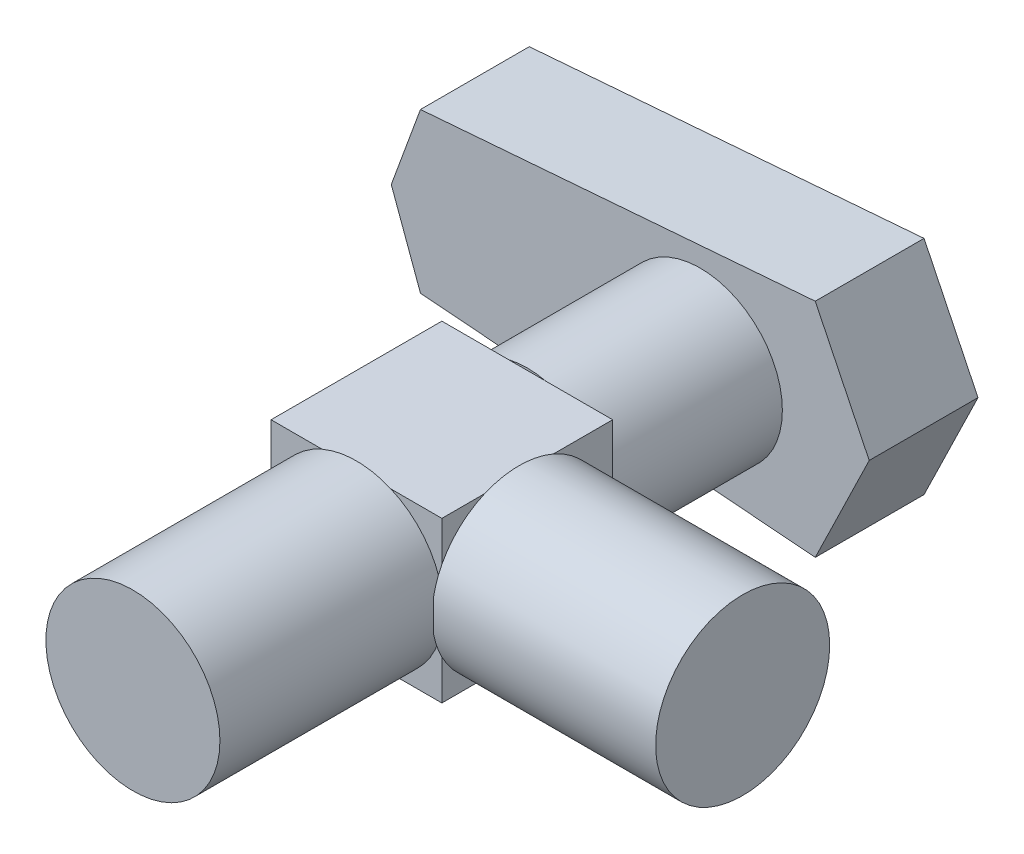
ISO-10303-21;
HEADER;
FILE_DESCRIPTION(('STEP AP214'),'2;1');
FILE_NAME('part.step','',(''),(''),'','','');
FILE_SCHEMA(('AUTOMOTIVE_DESIGN { 1 0 10303 214 1 1 1 1 }'));
ENDSEC;
DATA;
#1=APPLICATION_CONTEXT('core data for automotive mechanical design processes');
#2=APPLICATION_PROTOCOL_DEFINITION('international standard','automotive_design',2000,#1);
#3=PRODUCT_CONTEXT('',#1,'mechanical');
#4=PRODUCT('Part','Part','',(#3));
#5=PRODUCT_RELATED_PRODUCT_CATEGORY('part','',(#4));
#6=PRODUCT_DEFINITION_FORMATION('','',#4);
#7=PRODUCT_DEFINITION_CONTEXT('part definition',#1,'design');
#8=PRODUCT_DEFINITION('design','',#6,#7);
#9=PRODUCT_DEFINITION_SHAPE('','',#8);
#10=(LENGTH_UNIT() NAMED_UNIT(*) SI_UNIT(.MILLI.,.METRE.));
#11=(NAMED_UNIT(*) PLANE_ANGLE_UNIT() SI_UNIT($,.RADIAN.));
#12=(NAMED_UNIT(*) SI_UNIT($,.STERADIAN.) SOLID_ANGLE_UNIT());
#13=UNCERTAINTY_MEASURE_WITH_UNIT(LENGTH_MEASURE(1.E-05),#10,'distance_accuracy_value','');
#14=(GEOMETRIC_REPRESENTATION_CONTEXT(3) GLOBAL_UNCERTAINTY_ASSIGNED_CONTEXT((#13)) GLOBAL_UNIT_ASSIGNED_CONTEXT((#10,
#11,#12)) REPRESENTATION_CONTEXT('',''));
#15=CARTESIAN_POINT('',(0.,0.,0.));
#16=DIRECTION('',(0.,0.,1.));
#17=DIRECTION('',(1.,0.,0.));
#18=AXIS2_PLACEMENT_3D('',#15,#16,#17);
#19=CARTESIAN_POINT('',(-7.85,-7.35,7.85));
#20=DIRECTION('',(0.,0.,1.));
#21=DIRECTION('',(1.,0.,0.));
#22=AXIS2_PLACEMENT_3D('',#19,#20,#21);
#23=PLANE('',#22);
#24=DIRECTION('',(0.,1.,0.));
#25=VECTOR('',#24,1.);
#26=CARTESIAN_POINT('',(7.85,-7.35,7.85));
#27=LINE('',#26,#25);
#28=CARTESIAN_POINT('',(7.85,-3.68646171823335,7.85));
#29=VERTEX_POINT('',#28);
#30=CARTESIAN_POINT('',(7.85,-1.54191439451094,7.85));
#31=VERTEX_POINT('',#30);
#32=EDGE_CURVE('E178',#29,#31,#27,.T.);
#33=ORIENTED_EDGE('',*,*,#32,.T.);
#34=CARTESIAN_POINT('',(0.,0.,7.85));
#35=DIRECTION('',(0.,0.,1.));
#36=DIRECTION('',(1.,0.,0.));
#37=AXIS2_PLACEMENT_3D('',#34,#35,#36);
#38=CIRCLE('',#37,8.);
#39=CARTESIAN_POINT('',(3.15871809441742,-7.35,7.85));
#40=VERTEX_POINT('',#39);
#41=EDGE_CURVE('E192',#40,#31,#38,.T.);
#42=ORIENTED_EDGE('',*,*,#41,.F.);
#43=DIRECTION('',(1.,0.,0.));
#44=VECTOR('',#43,1.);
#45=CARTESIAN_POINT('',(-7.85,-7.35,7.85));
#46=LINE('',#45,#44);
#47=CARTESIAN_POINT('',(7.85,-7.35,7.85));
#48=VERTEX_POINT('',#47);
#49=EDGE_CURVE('E229',#40,#48,#46,.T.);
#50=ORIENTED_EDGE('',*,*,#49,.T.);
#51=EDGE_CURVE('E181',#48,#29,#27,.T.);
#52=ORIENTED_EDGE('',*,*,#51,.T.);
#53=EDGE_LOOP('',(#33,#42,#50,#52));
#54=FACE_BOUND('',#53,.T.);
#55=ADVANCED_FACE('F31',(#54),#23,.T.);
#56=CARTESIAN_POINT('',(-7.85,-7.35,7.85));
#57=VERTEX_POINT('',#56);
#58=CARTESIAN_POINT('',(-3.15871809441742,-7.35,7.85));
#59=VERTEX_POINT('',#58);
#60=EDGE_CURVE('E227',#57,#59,#46,.T.);
#61=ORIENTED_EDGE('',*,*,#60,.T.);
#62=CARTESIAN_POINT('',(-7.85,-1.54191439451093,7.85));
#63=VERTEX_POINT('',#62);
#64=EDGE_CURVE('E54',#63,#59,#38,.T.);
#65=ORIENTED_EDGE('',*,*,#64,.F.);
#66=DIRECTION('',(0.,1.,0.));
#67=VECTOR('',#66,1.);
#68=CARTESIAN_POINT('',(-7.85,-7.35,7.85));
#69=LINE('',#68,#67);
#70=EDGE_CURVE('E207',#57,#63,#69,.T.);
#71=ORIENTED_EDGE('',*,*,#70,.F.);
#72=EDGE_LOOP('',(#61,#65,#71));
#73=FACE_BOUND('',#72,.T.);
#74=ADVANCED_FACE('F336',(#73),#23,.T.);
#75=CARTESIAN_POINT('',(-7.85,1.54191439451093,7.85));
#76=VERTEX_POINT('',#75);
#77=CARTESIAN_POINT('',(-7.85,7.35,7.85));
#78=VERTEX_POINT('',#77);
#79=EDGE_CURVE('E46',#76,#78,#69,.T.);
#80=ORIENTED_EDGE('',*,*,#79,.F.);
#81=CARTESIAN_POINT('',(-3.15871809441742,7.35,7.85));
#82=VERTEX_POINT('',#81);
#83=EDGE_CURVE('E574',#82,#76,#38,.T.);
#84=ORIENTED_EDGE('',*,*,#83,.F.);
#85=DIRECTION('',(1.,0.,0.));
#86=VECTOR('',#85,1.);
#87=CARTESIAN_POINT('',(-7.85,7.35,7.85));
#88=LINE('',#87,#86);
#89=EDGE_CURVE('E243',#78,#82,#88,.T.);
#90=ORIENTED_EDGE('',*,*,#89,.F.);
#91=EDGE_LOOP('',(#80,#84,#90));
#92=FACE_BOUND('',#91,.T.);
#93=ADVANCED_FACE('F341',(#92),#23,.T.);
#94=CARTESIAN_POINT('',(3.15871809441742,7.35,7.85));
#95=VERTEX_POINT('',#94);
#96=CARTESIAN_POINT('',(7.85,7.35,7.85));
#97=VERTEX_POINT('',#96);
#98=EDGE_CURVE('E185',#95,#97,#88,.T.);
#99=ORIENTED_EDGE('',*,*,#98,.F.);
#100=CARTESIAN_POINT('',(7.85,1.54191439451094,7.85));
#101=VERTEX_POINT('',#100);
#102=EDGE_CURVE('E183',#101,#95,#38,.T.);
#103=ORIENTED_EDGE('',*,*,#102,.F.);
#104=CARTESIAN_POINT('',(7.85,3.68646171823335,7.85));
#105=VERTEX_POINT('',#104);
#106=EDGE_CURVE('E168',#101,#105,#27,.T.);
#107=ORIENTED_EDGE('',*,*,#106,.T.);
#108=EDGE_CURVE('E179',#105,#97,#27,.T.);
#109=ORIENTED_EDGE('',*,*,#108,.T.);
#110=EDGE_LOOP('',(#99,#103,#107,#109));
#111=FACE_BOUND('',#110,.T.);
#112=ADVANCED_FACE('F184',(#111),#23,.T.);
#113=CARTESIAN_POINT('',(28.4,0.,0.749999999999999));
#114=DIRECTION('',(-1.,0.,0.));
#115=DIRECTION('',(0.,0.,1.));
#116=AXIS2_PLACEMENT_3D('',#113,#114,#115);
#117=CYLINDRICAL_SURFACE('',#116,8.);
#118=CARTESIAN_POINT('',(28.4,0.,0.749999999999999));
#119=DIRECTION('',(1.,0.,0.));
#120=DIRECTION('',(0.,0.,-1.));
#121=AXIS2_PLACEMENT_3D('',#118,#119,#120);
#122=CIRCLE('',#121,8.);
#123=CARTESIAN_POINT('',(28.4,0.,-7.25));
#124=VERTEX_POINT('',#123);
#125=EDGE_CURVE('E249',#124,#124,#122,.T.);
#126=ORIENTED_EDGE('',*,*,#125,.F.);
#127=EDGE_LOOP('',(#126));
#128=FACE_BOUND('',#127,.T.);
#129=CARTESIAN_POINT('',(0.,0.,0.750000000000002));
#130=DIRECTION('',(-0.707106781186547,0.,0.707106781186547));
#131=DIRECTION('',(-0.707106781186548,0.,-0.707106781186547));
#132=AXIS2_PLACEMENT_3D('',#129,#130,#131);
#133=ELLIPSE('',#132,11.3137084989848,8.);
#134=CARTESIAN_POINT('',(7.85,-1.54191439451092,8.6));
#135=VERTEX_POINT('',#134);
#136=CARTESIAN_POINT('',(7.85,1.54191439451092,8.6));
#137=VERTEX_POINT('',#136);
#138=EDGE_CURVE('E196',#135,#137,#133,.T.);
#139=ORIENTED_EDGE('',*,*,#138,.F.);
#140=CARTESIAN_POINT('',(7.85,0.,0.750000000000002));
#141=DIRECTION('',(1.,0.,0.));
#142=DIRECTION('',(0.,0.,-1.));
#143=AXIS2_PLACEMENT_3D('',#140,#141,#142);
#144=CIRCLE('',#143,8.);
#145=EDGE_CURVE('E253',#135,#29,#144,.T.);
#146=ORIENTED_EDGE('',*,*,#145,.T.);
#147=CARTESIAN_POINT('',(7.85,-7.35,3.90871809441742));
#148=VERTEX_POINT('',#147);
#149=EDGE_CURVE('E660',#29,#148,#144,.T.);
#150=ORIENTED_EDGE('',*,*,#149,.T.);
#151=CARTESIAN_POINT('',(7.85,-7.35,-2.40871809441742));
#152=VERTEX_POINT('',#151);
#153=EDGE_CURVE('E258',#148,#152,#144,.T.);
#154=ORIENTED_EDGE('',*,*,#153,.T.);
#155=CARTESIAN_POINT('',(7.85,7.35,-2.40871809441742));
#156=VERTEX_POINT('',#155);
#157=EDGE_CURVE('E216',#152,#156,#144,.T.);
#158=ORIENTED_EDGE('',*,*,#157,.T.);
#159=CARTESIAN_POINT('',(7.85,7.35,3.90871809441742));
#160=VERTEX_POINT('',#159);
#161=EDGE_CURVE('E250',#156,#160,#144,.T.);
#162=ORIENTED_EDGE('',*,*,#161,.T.);
#163=EDGE_CURVE('E663',#160,#105,#144,.T.);
#164=ORIENTED_EDGE('',*,*,#163,.T.);
#165=EDGE_CURVE('E173',#105,#137,#144,.T.);
#166=ORIENTED_EDGE('',*,*,#165,.T.);
#167=EDGE_LOOP('',(#139,#146,#150,#154,#158,#162,#164,#166));
#168=FACE_BOUND('',#167,.T.);
#169=ADVANCED_FACE('F345',(#128,#168),#117,.T.);
#170=CARTESIAN_POINT('',(7.85,0.,0.750000000000002));
#171=DIRECTION('',(1.,0.,0.));
#172=DIRECTION('',(0.,0.,-1.));
#173=AXIS2_PLACEMENT_3D('',#170,#171,#172);
#174=PLANE('',#173);
#175=DIRECTION('',(0.,0.,-1.));
#176=VECTOR('',#175,1.);
#177=CARTESIAN_POINT('',(7.85,-1.54191439451092,28.4));
#178=LINE('',#177,#176);
#179=EDGE_CURVE('E11',#31,#135,#178,.F.);
#180=ORIENTED_EDGE('',*,*,#179,.F.);
#181=ORIENTED_EDGE('',*,*,#32,.F.);
#182=ORIENTED_EDGE('',*,*,#145,.F.);
#183=EDGE_LOOP('',(#180,#181,#182));
#184=FACE_BOUND('',#183,.T.);
#185=ADVANCED_FACE('F350',(#184),#174,.F.);
#186=DIRECTION('',(0.,0.,-1.));
#187=VECTOR('',#186,1.);
#188=CARTESIAN_POINT('',(7.85,1.54191439451092,28.4));
#189=LINE('',#188,#187);
#190=EDGE_CURVE('E39',#137,#101,#189,.T.);
#191=ORIENTED_EDGE('',*,*,#190,.F.);
#192=ORIENTED_EDGE('',*,*,#165,.F.);
#193=ORIENTED_EDGE('',*,*,#106,.F.);
#194=EDGE_LOOP('',(#191,#192,#193));
#195=FACE_BOUND('',#194,.T.);
#196=ADVANCED_FACE('F170',(#195),#174,.F.);
#197=CARTESIAN_POINT('',(-7.85,-7.35,-7.85));
#198=DIRECTION('',(0.,0.,-1.));
#199=DIRECTION('',(-1.,0.,0.));
#200=AXIS2_PLACEMENT_3D('',#197,#198,#199);
#201=PLANE('',#200);
#202=CARTESIAN_POINT('',(0.,0.,-7.85));
#203=DIRECTION('',(0.,0.,-1.));
#204=DIRECTION('',(-1.,0.,0.));
#205=AXIS2_PLACEMENT_3D('',#202,#203,#204);
#206=CIRCLE('',#205,7.55);
#207=CARTESIAN_POINT('',(1.7262676501632,7.35,-7.85));
#208=VERTEX_POINT('',#207);
#209=CARTESIAN_POINT('',(1.7262676501632,-7.35,-7.85));
#210=VERTEX_POINT('',#209);
#211=EDGE_CURVE('E197',#208,#210,#206,.T.);
#212=ORIENTED_EDGE('',*,*,#211,.F.);
#213=DIRECTION('',(-1.,0.,0.));
#214=VECTOR('',#213,1.);
#215=CARTESIAN_POINT('',(-7.85,7.35,-7.85));
#216=LINE('',#215,#214);
#217=CARTESIAN_POINT('',(7.85,7.35,-7.85));
#218=VERTEX_POINT('',#217);
#219=EDGE_CURVE('E233',#218,#208,#216,.T.);
#220=ORIENTED_EDGE('',*,*,#219,.F.);
#221=DIRECTION('',(0.,1.,0.));
#222=VECTOR('',#221,1.);
#223=CARTESIAN_POINT('',(7.85,-7.35,-7.85));
#224=LINE('',#223,#222);
#225=CARTESIAN_POINT('',(7.85,-7.35,-7.85));
#226=VERTEX_POINT('',#225);
#227=EDGE_CURVE('E210',#226,#218,#224,.T.);
#228=ORIENTED_EDGE('',*,*,#227,.F.);
#229=DIRECTION('',(-1.,0.,0.));
#230=VECTOR('',#229,1.);
#231=CARTESIAN_POINT('',(-7.85,-7.35,-7.85));
#232=LINE('',#231,#230);
#233=EDGE_CURVE('E217',#226,#210,#232,.T.);
#234=ORIENTED_EDGE('',*,*,#233,.T.);
#235=EDGE_LOOP('',(#212,#220,#228,#234));
#236=FACE_BOUND('',#235,.T.);
#237=ADVANCED_FACE('F485',(#236),#201,.T.);
#238=CARTESIAN_POINT('',(7.85,-7.35,-7.85));
#239=DIRECTION('',(1.,0.,0.));
#240=DIRECTION('',(0.,0.,-1.));
#241=AXIS2_PLACEMENT_3D('',#238,#239,#240);
#242=PLANE('',#241);
#243=ORIENTED_EDGE('',*,*,#163,.F.);
#244=DIRECTION('',(0.,0.,-1.));
#245=VECTOR('',#244,1.);
#246=CARTESIAN_POINT('',(7.85,7.35,-7.85));
#247=LINE('',#246,#245);
#248=EDGE_CURVE('E238',#97,#160,#247,.T.);
#249=ORIENTED_EDGE('',*,*,#248,.F.);
#250=ORIENTED_EDGE('',*,*,#108,.F.);
#251=EDGE_LOOP('',(#243,#249,#250));
#252=FACE_BOUND('',#251,.T.);
#253=ADVANCED_FACE('F496',(#252),#242,.T.);
#254=ORIENTED_EDGE('',*,*,#149,.F.);
#255=ORIENTED_EDGE('',*,*,#51,.F.);
#256=DIRECTION('',(0.,0.,-1.));
#257=VECTOR('',#256,1.);
#258=CARTESIAN_POINT('',(7.85,-7.35,-7.85));
#259=LINE('',#258,#257);
#260=EDGE_CURVE('E222',#48,#148,#259,.T.);
#261=ORIENTED_EDGE('',*,*,#260,.T.);
#262=EDGE_LOOP('',(#254,#255,#261));
#263=FACE_BOUND('',#262,.T.);
#264=ADVANCED_FACE('F537',(#263),#242,.T.);
#265=CARTESIAN_POINT('',(-7.85,-7.35,-7.85));
#266=DIRECTION('',(-1.,0.,0.));
#267=DIRECTION('',(0.,0.,1.));
#268=AXIS2_PLACEMENT_3D('',#265,#266,#267);
#269=PLANE('',#268);
#270=ORIENTED_EDGE('',*,*,#70,.T.);
#271=DIRECTION('',(0.,1.,0.));
#272=VECTOR('',#271,1.);
#273=CARTESIAN_POINT('',(-7.85,-7.35,7.85));
#274=LINE('',#273,#272);
#275=EDGE_CURVE('E307',#63,#76,#274,.T.);
#276=ORIENTED_EDGE('',*,*,#275,.T.);
#277=ORIENTED_EDGE('',*,*,#79,.T.);
#278=DIRECTION('',(0.,0.,1.));
#279=VECTOR('',#278,1.);
#280=CARTESIAN_POINT('',(-7.85,7.35,-7.85));
#281=LINE('',#280,#279);
#282=CARTESIAN_POINT('',(-7.85,7.35,-7.85));
#283=VERTEX_POINT('',#282);
#284=EDGE_CURVE('E246',#283,#78,#281,.T.);
#285=ORIENTED_EDGE('',*,*,#284,.F.);
#286=DIRECTION('',(0.,1.,0.));
#287=VECTOR('',#286,1.);
#288=CARTESIAN_POINT('',(-7.85,-7.35,-7.85));
#289=LINE('',#288,#287);
#290=CARTESIAN_POINT('',(-7.85,-7.35,-7.85));
#291=VERTEX_POINT('',#290);
#292=EDGE_CURVE('E213',#291,#283,#289,.T.);
#293=ORIENTED_EDGE('',*,*,#292,.F.);
#294=DIRECTION('',(0.,0.,1.));
#295=VECTOR('',#294,1.);
#296=CARTESIAN_POINT('',(-7.85,-7.35,-7.85));
#297=LINE('',#296,#295);
#298=EDGE_CURVE('E230',#291,#57,#297,.T.);
#299=ORIENTED_EDGE('',*,*,#298,.T.);
#300=EDGE_LOOP('',(#270,#276,#277,#285,#293,#299));
#301=FACE_BOUND('',#300,.T.);
#302=ADVANCED_FACE('F33',(#301),#269,.T.);
#303=CARTESIAN_POINT('',(-1.7262676501632,-7.35,-7.85));
#304=VERTEX_POINT('',#303);
#305=CARTESIAN_POINT('',(-1.7262676501632,7.35,-7.85));
#306=VERTEX_POINT('',#305);
#307=EDGE_CURVE('E199',#304,#306,#206,.T.);
#308=ORIENTED_EDGE('',*,*,#307,.F.);
#309=EDGE_CURVE('E221',#304,#291,#232,.T.);
#310=ORIENTED_EDGE('',*,*,#309,.T.);
#311=ORIENTED_EDGE('',*,*,#292,.T.);
#312=EDGE_CURVE('E237',#306,#283,#216,.T.);
#313=ORIENTED_EDGE('',*,*,#312,.F.);
#314=EDGE_LOOP('',(#308,#310,#311,#313));
#315=FACE_BOUND('',#314,.T.);
#316=ADVANCED_FACE('F477',(#315),#201,.T.);
#317=ORIENTED_EDGE('',*,*,#157,.F.);
#318=EDGE_CURVE('E226',#152,#226,#259,.T.);
#319=ORIENTED_EDGE('',*,*,#318,.T.);
#320=ORIENTED_EDGE('',*,*,#227,.T.);
#321=EDGE_CURVE('E242',#156,#218,#247,.T.);
#322=ORIENTED_EDGE('',*,*,#321,.F.);
#323=EDGE_LOOP('',(#317,#319,#320,#322));
#324=FACE_BOUND('',#323,.T.);
#325=ADVANCED_FACE('F482',(#324),#242,.T.);
#326=CARTESIAN_POINT('',(-7.85,-7.35,7.85));
#327=DIRECTION('',(0.,1.,0.));
#328=DIRECTION('',(0.,0.,1.));
#329=AXIS2_PLACEMENT_3D('',#326,#327,#328);
#330=PLANE('',#329);
#331=ORIENTED_EDGE('',*,*,#298,.F.);
#332=ORIENTED_EDGE('',*,*,#309,.F.);
#333=EDGE_CURVE('E220',#210,#304,#232,.T.);
#334=ORIENTED_EDGE('',*,*,#333,.F.);
#335=ORIENTED_EDGE('',*,*,#233,.F.);
#336=ORIENTED_EDGE('',*,*,#318,.F.);
#337=EDGE_CURVE('E225',#148,#152,#259,.T.);
#338=ORIENTED_EDGE('',*,*,#337,.F.);
#339=ORIENTED_EDGE('',*,*,#260,.F.);
#340=ORIENTED_EDGE('',*,*,#49,.F.);
#341=DIRECTION('',(1.,0.,0.));
#342=VECTOR('',#341,1.);
#343=CARTESIAN_POINT('',(-7.85,-7.35,7.85));
#344=LINE('',#343,#342);
#345=EDGE_CURVE('E309',#59,#40,#344,.T.);
#346=ORIENTED_EDGE('',*,*,#345,.F.);
#347=ORIENTED_EDGE('',*,*,#60,.F.);
#348=EDGE_LOOP('',(#331,#332,#334,#335,#336,#338,#339,#340,#346,#347));
#349=FACE_BOUND('',#348,.T.);
#350=ADVANCED_FACE('F535',(#349),#330,.F.);
#351=CARTESIAN_POINT('',(-7.85,7.35,7.85));
#352=DIRECTION('',(0.,1.,0.));
#353=DIRECTION('',(0.,0.,1.));
#354=AXIS2_PLACEMENT_3D('',#351,#352,#353);
#355=PLANE('',#354);
#356=ORIENTED_EDGE('',*,*,#284,.T.);
#357=ORIENTED_EDGE('',*,*,#89,.T.);
#358=DIRECTION('',(1.,0.,0.));
#359=VECTOR('',#358,1.);
#360=CARTESIAN_POINT('',(-7.85,7.35,7.85));
#361=LINE('',#360,#359);
#362=EDGE_CURVE('E312',#82,#95,#361,.T.);
#363=ORIENTED_EDGE('',*,*,#362,.T.);
#364=ORIENTED_EDGE('',*,*,#98,.T.);
#365=ORIENTED_EDGE('',*,*,#248,.T.);
#366=EDGE_CURVE('E241',#160,#156,#247,.T.);
#367=ORIENTED_EDGE('',*,*,#366,.T.);
#368=ORIENTED_EDGE('',*,*,#321,.T.);
#369=ORIENTED_EDGE('',*,*,#219,.T.);
#370=EDGE_CURVE('E236',#208,#306,#216,.T.);
#371=ORIENTED_EDGE('',*,*,#370,.T.);
#372=ORIENTED_EDGE('',*,*,#312,.T.);
#373=EDGE_LOOP('',(#356,#357,#363,#364,#365,#367,#368,#369,#371,#372));
#374=FACE_BOUND('',#373,.T.);
#375=ADVANCED_FACE('F526',(#374),#355,.T.);
#376=ORIENTED_EDGE('',*,*,#366,.F.);
#377=ORIENTED_EDGE('',*,*,#161,.F.);
#378=EDGE_LOOP('',(#376,#377));
#379=FACE_BOUND('',#378,.T.);
#380=ADVANCED_FACE('F516',(#379),#174,.F.);
#381=ORIENTED_EDGE('',*,*,#153,.F.);
#382=ORIENTED_EDGE('',*,*,#337,.T.);
#383=EDGE_LOOP('',(#381,#382));
#384=FACE_BOUND('',#383,.T.);
#385=ADVANCED_FACE('F506',(#384),#174,.F.);
#386=CARTESIAN_POINT('',(28.4,0.,0.749999999999999));
#387=DIRECTION('',(1.,0.,0.));
#388=DIRECTION('',(0.,0.,-1.));
#389=AXIS2_PLACEMENT_3D('',#386,#387,#388);
#390=PLANE('',#389);
#391=ORIENTED_EDGE('',*,*,#125,.T.);
#392=EDGE_LOOP('',(#391));
#393=FACE_BOUND('',#392,.T.);
#394=ADVANCED_FACE('F470',(#393),#390,.T.);
#395=CARTESIAN_POINT('',(0.,0.,-7.85));
#396=DIRECTION('',(0.,0.,-1.));
#397=DIRECTION('',(-1.,0.,0.));
#398=AXIS2_PLACEMENT_3D('',#395,#396,#397);
#399=PLANE('',#398);
#400=EDGE_CURVE('E201',#210,#304,#206,.T.);
#401=ORIENTED_EDGE('',*,*,#400,.F.);
#402=ORIENTED_EDGE('',*,*,#333,.T.);
#403=EDGE_LOOP('',(#401,#402));
#404=FACE_BOUND('',#403,.T.);
#405=ADVANCED_FACE('F453',(#404),#399,.F.);
#406=CARTESIAN_POINT('',(0.,0.,-33.75));
#407=DIRECTION('',(0.,0.,1.));
#408=DIRECTION('',(1.,0.,0.));
#409=AXIS2_PLACEMENT_3D('',#406,#407,#408);
#410=CYLINDRICAL_SURFACE('',#409,7.55);
#411=CARTESIAN_POINT('',(0.,0.,-23.75));
#412=DIRECTION('',(0.,0.,1.));
#413=DIRECTION('',(1.,0.,0.));
#414=AXIS2_PLACEMENT_3D('',#411,#412,#413);
#415=CIRCLE('',#414,7.55);
#416=CARTESIAN_POINT('',(7.55,0.,-23.75));
#417=VERTEX_POINT('',#416);
#418=EDGE_CURVE('E203',#417,#417,#415,.T.);
#419=ORIENTED_EDGE('',*,*,#418,.T.);
#420=EDGE_LOOP('',(#419));
#421=FACE_BOUND('',#420,.T.);
#422=EDGE_CURVE('E255',#306,#208,#206,.T.);
#423=ORIENTED_EDGE('',*,*,#422,.T.);
#424=ORIENTED_EDGE('',*,*,#211,.T.);
#425=ORIENTED_EDGE('',*,*,#400,.T.);
#426=ORIENTED_EDGE('',*,*,#307,.T.);
#427=EDGE_LOOP('',(#423,#424,#425,#426));
#428=FACE_BOUND('',#427,.T.);
#429=ADVANCED_FACE('F448',(#421,#428),#410,.T.);
#430=ORIENTED_EDGE('',*,*,#370,.F.);
#431=ORIENTED_EDGE('',*,*,#422,.F.);
#432=EDGE_LOOP('',(#430,#431));
#433=FACE_BOUND('',#432,.T.);
#434=ADVANCED_FACE('F441',(#433),#399,.F.);
#435=CARTESIAN_POINT('',(10.5721072127905,10.1985449394511,-23.75));
#436=DIRECTION('',(0.,0.,1.));
#437=DIRECTION('',(1.,0.,0.));
#438=AXIS2_PLACEMENT_3D('',#435,#436,#437);
#439=PLANE('',#438);
#440=DIRECTION('',(0.437368180066445,-0.899282533503996,0.));
#441=VECTOR('',#440,1.);
#442=CARTESIAN_POINT('',(15.5321935853274,-1.0846072810894E-13,-23.75));
#443=LINE('',#442,#441);
#444=CARTESIAN_POINT('',(10.5721072127905,10.1985449394511,-23.75));
#445=VERTEX_POINT('',#444);
#446=CARTESIAN_POINT('',(15.5321935853274,-1.0846072810894E-13,-23.75));
#447=VERTEX_POINT('',#446);
#448=EDGE_CURVE('E274',#445,#447,#443,.T.);
#449=ORIENTED_EDGE('',*,*,#448,.F.);
#450=DIRECTION('',(0.996854940874737,0.079247882328961,0.));
#451=VECTOR('',#450,1.);
#452=CARTESIAN_POINT('',(10.5721072127905,10.1985449394511,-23.75));
#453=LINE('',#452,#451);
#454=CARTESIAN_POINT('',(-25.7175043087301,7.31359674317932,-23.75));
#455=VERTEX_POINT('',#454);
#456=EDGE_CURVE('E262',#455,#445,#453,.T.);
#457=ORIENTED_EDGE('',*,*,#456,.F.);
#458=DIRECTION('',(0.344350100440591,0.938841311578562,0.));
#459=VECTOR('',#458,1.);
#460=CARTESIAN_POINT('',(-25.7175043087301,7.31359674317932,-23.75));
#461=LINE('',#460,#459);
#462=CARTESIAN_POINT('',(-28.4,1.9831614004629E-13,-23.75));
#463=VERTEX_POINT('',#462);
#464=EDGE_CURVE('E292',#463,#455,#461,.T.);
#465=ORIENTED_EDGE('',*,*,#464,.F.);
#466=DIRECTION('',(-0.344350100440568,0.93884131157857,0.));
#467=VECTOR('',#466,1.);
#468=CARTESIAN_POINT('',(-25.7175043087301,-7.31359674317948,-23.75));
#469=LINE('',#468,#467);
#470=CARTESIAN_POINT('',(-25.7175043087301,-7.31359674317948,-23.75));
#471=VERTEX_POINT('',#470);
#472=EDGE_CURVE('E295',#471,#463,#469,.T.);
#473=ORIENTED_EDGE('',*,*,#472,.F.);
#474=DIRECTION('',(-0.996854940874737,0.0792478823289611,0.));
#475=VECTOR('',#474,1.);
#476=CARTESIAN_POINT('',(10.5721072127904,-10.1985449394512,-23.75));
#477=LINE('',#476,#475);
#478=CARTESIAN_POINT('',(10.5721072127904,-10.1985449394512,-23.75));
#479=VERTEX_POINT('',#478);
#480=EDGE_CURVE('E298',#479,#471,#477,.T.);
#481=ORIENTED_EDGE('',*,*,#480,.F.);
#482=DIRECTION('',(-0.437368180066458,-0.89928253350399,0.));
#483=VECTOR('',#482,1.);
#484=CARTESIAN_POINT('',(15.5321935853274,-1.0846072810894E-13,-23.75));
#485=LINE('',#484,#483);
#486=EDGE_CURVE('E301',#447,#479,#485,.T.);
#487=ORIENTED_EDGE('',*,*,#486,.F.);
#488=EDGE_LOOP('',(#449,#457,#465,#473,#481,#487));
#489=FACE_BOUND('',#488,.T.);
#490=ORIENTED_EDGE('',*,*,#418,.F.);
#491=EDGE_LOOP('',(#490));
#492=FACE_BOUND('',#491,.T.);
#493=ADVANCED_FACE('F431',(#489,#492),#439,.T.);
#494=CARTESIAN_POINT('',(15.5321935853274,-1.0846072810894E-13,-23.75));
#495=DIRECTION('',(0.899282533503996,0.437368180066445,0.));
#496=DIRECTION('',(-0.437368180066445,0.899282533503996,0.));
#497=AXIS2_PLACEMENT_3D('',#494,#495,#496);
#498=PLANE('',#497);
#499=DIRECTION('',(0.437368180066445,-0.899282533503996,0.));
#500=VECTOR('',#499,1.);
#501=CARTESIAN_POINT('',(15.5321935853274,-1.0846072810894E-13,-33.75));
#502=LINE('',#501,#500);
#503=CARTESIAN_POINT('',(10.5721072127905,10.1985449394511,-33.75));
#504=VERTEX_POINT('',#503);
#505=CARTESIAN_POINT('',(15.5321935853274,-1.0846072810894E-13,-33.75));
#506=VERTEX_POINT('',#505);
#507=EDGE_CURVE('E287',#504,#506,#502,.T.);
#508=ORIENTED_EDGE('',*,*,#507,.F.);
#509=DIRECTION('',(0.,0.,-1.));
#510=VECTOR('',#509,1.);
#511=CARTESIAN_POINT('',(10.5721072127905,10.1985449394511,-23.75));
#512=LINE('',#511,#510);
#513=EDGE_CURVE('E206',#445,#504,#512,.T.);
#514=ORIENTED_EDGE('',*,*,#513,.F.);
#515=ORIENTED_EDGE('',*,*,#448,.T.);
#516=DIRECTION('',(0.,0.,-1.));
#517=VECTOR('',#516,1.);
#518=CARTESIAN_POINT('',(15.5321935853274,-1.0846072810894E-13,-23.75));
#519=LINE('',#518,#517);
#520=EDGE_CURVE('E259',#447,#506,#519,.T.);
#521=ORIENTED_EDGE('',*,*,#520,.T.);
#522=EDGE_LOOP('',(#508,#514,#515,#521));
#523=FACE_BOUND('',#522,.T.);
#524=ADVANCED_FACE('F421',(#523),#498,.T.);
#525=CARTESIAN_POINT('',(10.5721072127905,10.1985449394511,-23.75));
#526=DIRECTION('',(-0.079247882328961,0.996854940874737,0.));
#527=DIRECTION('',(-0.996854940874737,-0.079247882328961,0.));
#528=AXIS2_PLACEMENT_3D('',#525,#526,#527);
#529=PLANE('',#528);
#530=DIRECTION('',(0.996854940874737,0.079247882328961,0.));
#531=VECTOR('',#530,1.);
#532=CARTESIAN_POINT('',(10.5721072127905,10.1985449394511,-33.75));
#533=LINE('',#532,#531);
#534=CARTESIAN_POINT('',(-25.7175043087301,7.31359674317932,-33.75));
#535=VERTEX_POINT('',#534);
#536=EDGE_CURVE('E271',#535,#504,#533,.T.);
#537=ORIENTED_EDGE('',*,*,#536,.F.);
#538=DIRECTION('',(0.,0.,-1.));
#539=VECTOR('',#538,1.);
#540=CARTESIAN_POINT('',(-25.7175043087301,7.31359674317932,-23.75));
#541=LINE('',#540,#539);
#542=EDGE_CURVE('E268',#455,#535,#541,.T.);
#543=ORIENTED_EDGE('',*,*,#542,.F.);
#544=ORIENTED_EDGE('',*,*,#456,.T.);
#545=ORIENTED_EDGE('',*,*,#513,.T.);
#546=EDGE_LOOP('',(#537,#543,#544,#545));
#547=FACE_BOUND('',#546,.T.);
#548=ADVANCED_FACE('F411',(#547),#529,.T.);
#549=CARTESIAN_POINT('',(-25.7175043087301,7.31359674317932,-23.75));
#550=DIRECTION('',(-0.938841311578562,0.344350100440591,0.));
#551=DIRECTION('',(-0.344350100440591,-0.938841311578562,0.));
#552=AXIS2_PLACEMENT_3D('',#549,#550,#551);
#553=PLANE('',#552);
#554=DIRECTION('',(0.344350100440591,0.938841311578562,0.));
#555=VECTOR('',#554,1.);
#556=CARTESIAN_POINT('',(-25.7175043087301,7.31359674317932,-33.75));
#557=LINE('',#556,#555);
#558=CARTESIAN_POINT('',(-28.4,1.9831614004629E-13,-33.75));
#559=VERTEX_POINT('',#558);
#560=EDGE_CURVE('E275',#559,#535,#557,.T.);
#561=ORIENTED_EDGE('',*,*,#560,.F.);
#562=DIRECTION('',(0.,0.,-1.));
#563=VECTOR('',#562,1.);
#564=CARTESIAN_POINT('',(-28.4,1.9831614004629E-13,-23.75));
#565=LINE('',#564,#563);
#566=EDGE_CURVE('E266',#463,#559,#565,.T.);
#567=ORIENTED_EDGE('',*,*,#566,.F.);
#568=ORIENTED_EDGE('',*,*,#464,.T.);
#569=ORIENTED_EDGE('',*,*,#542,.T.);
#570=EDGE_LOOP('',(#561,#567,#568,#569));
#571=FACE_BOUND('',#570,.T.);
#572=ADVANCED_FACE('F401',(#571),#553,.T.);
#573=CARTESIAN_POINT('',(-25.7175043087301,-7.31359674317948,-23.75));
#574=DIRECTION('',(-0.938841311578571,-0.344350100440568,0.));
#575=DIRECTION('',(0.344350100440568,-0.938841311578571,0.));
#576=AXIS2_PLACEMENT_3D('',#573,#574,#575);
#577=PLANE('',#576);
#578=DIRECTION('',(-0.344350100440568,0.93884131157857,0.));
#579=VECTOR('',#578,1.);
#580=CARTESIAN_POINT('',(-25.7175043087301,-7.31359674317948,-33.75));
#581=LINE('',#580,#579);
#582=CARTESIAN_POINT('',(-25.7175043087301,-7.31359674317948,-33.75));
#583=VERTEX_POINT('',#582);
#584=EDGE_CURVE('E278',#583,#559,#581,.T.);
#585=ORIENTED_EDGE('',*,*,#584,.F.);
#586=DIRECTION('',(0.,0.,-1.));
#587=VECTOR('',#586,1.);
#588=CARTESIAN_POINT('',(-25.7175043087301,-7.31359674317948,-23.75));
#589=LINE('',#588,#587);
#590=EDGE_CURVE('E264',#471,#583,#589,.T.);
#591=ORIENTED_EDGE('',*,*,#590,.F.);
#592=ORIENTED_EDGE('',*,*,#472,.T.);
#593=ORIENTED_EDGE('',*,*,#566,.T.);
#594=EDGE_LOOP('',(#585,#591,#592,#593));
#595=FACE_BOUND('',#594,.T.);
#596=ADVANCED_FACE('F391',(#595),#577,.T.);
#597=CARTESIAN_POINT('',(10.5721072127904,-10.1985449394512,-23.75));
#598=DIRECTION('',(-0.0792478823289611,-0.996854940874737,0.));
#599=DIRECTION('',(0.996854940874737,-0.0792478823289611,0.));
#600=AXIS2_PLACEMENT_3D('',#597,#598,#599);
#601=PLANE('',#600);
#602=DIRECTION('',(-0.996854940874737,0.0792478823289611,0.));
#603=VECTOR('',#602,1.);
#604=CARTESIAN_POINT('',(10.5721072127904,-10.1985449394512,-33.75));
#605=LINE('',#604,#603);
#606=CARTESIAN_POINT('',(10.5721072127904,-10.1985449394512,-33.75));
#607=VERTEX_POINT('',#606);
#608=EDGE_CURVE('E281',#607,#583,#605,.T.);
#609=ORIENTED_EDGE('',*,*,#608,.F.);
#610=DIRECTION('',(0.,0.,-1.));
#611=VECTOR('',#610,1.);
#612=CARTESIAN_POINT('',(10.5721072127904,-10.1985449394512,-23.75));
#613=LINE('',#612,#611);
#614=EDGE_CURVE('E261',#479,#607,#613,.T.);
#615=ORIENTED_EDGE('',*,*,#614,.F.);
#616=ORIENTED_EDGE('',*,*,#480,.T.);
#617=ORIENTED_EDGE('',*,*,#590,.T.);
#618=EDGE_LOOP('',(#609,#615,#616,#617));
#619=FACE_BOUND('',#618,.T.);
#620=ADVANCED_FACE('F381',(#619),#601,.T.);
#621=CARTESIAN_POINT('',(15.5321935853274,-1.0846072810894E-13,-23.75));
#622=DIRECTION('',(0.89928253350399,-0.437368180066458,0.));
#623=DIRECTION('',(0.437368180066458,0.89928253350399,0.));
#624=AXIS2_PLACEMENT_3D('',#621,#622,#623);
#625=PLANE('',#624);
#626=DIRECTION('',(-0.437368180066458,-0.89928253350399,0.));
#627=VECTOR('',#626,1.);
#628=CARTESIAN_POINT('',(15.5321935853274,-1.0846072810894E-13,-33.75));
#629=LINE('',#628,#627);
#630=EDGE_CURVE('E284',#506,#607,#629,.T.);
#631=ORIENTED_EDGE('',*,*,#630,.F.);
#632=ORIENTED_EDGE('',*,*,#520,.F.);
#633=ORIENTED_EDGE('',*,*,#486,.T.);
#634=ORIENTED_EDGE('',*,*,#614,.T.);
#635=EDGE_LOOP('',(#631,#632,#633,#634));
#636=FACE_BOUND('',#635,.T.);
#637=ADVANCED_FACE('F331',(#636),#625,.T.);
#638=CARTESIAN_POINT('',(0.,0.,-33.75));
#639=DIRECTION('',(0.,0.,-1.));
#640=DIRECTION('',(-1.,0.,0.));
#641=AXIS2_PLACEMENT_3D('',#638,#639,#640);
#642=PLANE('',#641);
#643=ORIENTED_EDGE('',*,*,#507,.T.);
#644=ORIENTED_EDGE('',*,*,#630,.T.);
#645=ORIENTED_EDGE('',*,*,#608,.T.);
#646=ORIENTED_EDGE('',*,*,#584,.T.);
#647=ORIENTED_EDGE('',*,*,#560,.T.);
#648=ORIENTED_EDGE('',*,*,#536,.T.);
#649=EDGE_LOOP('',(#643,#644,#645,#646,#647,#648));
#650=FACE_BOUND('',#649,.T.);
#651=ADVANCED_FACE('F321',(#650),#642,.T.);
#652=CARTESIAN_POINT('',(0.,0.,28.4));
#653=DIRECTION('',(0.,0.,-1.));
#654=DIRECTION('',(-1.,0.,0.));
#655=AXIS2_PLACEMENT_3D('',#652,#653,#654);
#656=CYLINDRICAL_SURFACE('',#655,8.);
#657=CARTESIAN_POINT('',(0.,0.,28.4));
#658=DIRECTION('',(0.,0.,1.));
#659=DIRECTION('',(1.,0.,0.));
#660=AXIS2_PLACEMENT_3D('',#657,#658,#659);
#661=CIRCLE('',#660,8.);
#662=CARTESIAN_POINT('',(8.,0.,28.4));
#663=VERTEX_POINT('',#662);
#664=EDGE_CURVE('E189',#663,#663,#661,.T.);
#665=ORIENTED_EDGE('',*,*,#664,.F.);
#666=EDGE_LOOP('',(#665));
#667=FACE_BOUND('',#666,.T.);
#668=ORIENTED_EDGE('',*,*,#41,.T.);
#669=ORIENTED_EDGE('',*,*,#179,.T.);
#670=ORIENTED_EDGE('',*,*,#138,.T.);
#671=ORIENTED_EDGE('',*,*,#190,.T.);
#672=ORIENTED_EDGE('',*,*,#102,.T.);
#673=EDGE_CURVE('E190',#95,#82,#38,.T.);
#674=ORIENTED_EDGE('',*,*,#673,.T.);
#675=ORIENTED_EDGE('',*,*,#83,.T.);
#676=EDGE_CURVE('E572',#76,#63,#38,.T.);
#677=ORIENTED_EDGE('',*,*,#676,.T.);
#678=ORIENTED_EDGE('',*,*,#64,.T.);
#679=EDGE_CURVE('E571',#59,#40,#38,.T.);
#680=ORIENTED_EDGE('',*,*,#679,.T.);
#681=EDGE_LOOP('',(#668,#669,#670,#671,#672,#674,#675,#677,#678,#680));
#682=FACE_BOUND('',#681,.T.);
#683=ADVANCED_FACE('F195',(#667,#682),#656,.T.);
#684=CARTESIAN_POINT('',(0.,0.,7.85));
#685=DIRECTION('',(0.,0.,1.));
#686=DIRECTION('',(1.,0.,0.));
#687=AXIS2_PLACEMENT_3D('',#684,#685,#686);
#688=PLANE('',#687);
#689=ORIENTED_EDGE('',*,*,#679,.F.);
#690=ORIENTED_EDGE('',*,*,#345,.T.);
#691=EDGE_LOOP('',(#689,#690));
#692=FACE_BOUND('',#691,.T.);
#693=ADVANCED_FACE('F320',(#692),#688,.F.);
#694=ORIENTED_EDGE('',*,*,#275,.F.);
#695=ORIENTED_EDGE('',*,*,#676,.F.);
#696=EDGE_LOOP('',(#694,#695));
#697=FACE_BOUND('',#696,.T.);
#698=ADVANCED_FACE('F327',(#697),#688,.F.);
#699=ORIENTED_EDGE('',*,*,#362,.F.);
#700=ORIENTED_EDGE('',*,*,#673,.F.);
#701=EDGE_LOOP('',(#699,#700));
#702=FACE_BOUND('',#701,.T.);
#703=ADVANCED_FACE('F330',(#702),#688,.F.);
#704=CARTESIAN_POINT('',(0.,0.,28.4));
#705=DIRECTION('',(0.,0.,1.));
#706=DIRECTION('',(1.,0.,0.));
#707=AXIS2_PLACEMENT_3D('',#704,#705,#706);
#708=PLANE('',#707);
#709=ORIENTED_EDGE('',*,*,#664,.T.);
#710=EDGE_LOOP('',(#709));
#711=FACE_BOUND('',#710,.T.);
#712=ADVANCED_FACE('F317',(#711),#708,.T.);
#713=CLOSED_SHELL('',(#55,#74,#93,#112,#169,#185,#196,#237,#253,#264,#302,#316,#325,#350,#375,
#380,#385,#394,#405,#429,#434,#493,#524,#548,#572,#596,#620,#637,#651,#683,#693,#698,#703,#712));
#714=MANIFOLD_SOLID_BREP('B2',#713);
#715=ADVANCED_BREP_SHAPE_REPRESENTATION('',(#18,#714),#14);
#716=SHAPE_DEFINITION_REPRESENTATION(#9,#715);
ENDSEC;
END-ISO-10303-21;
